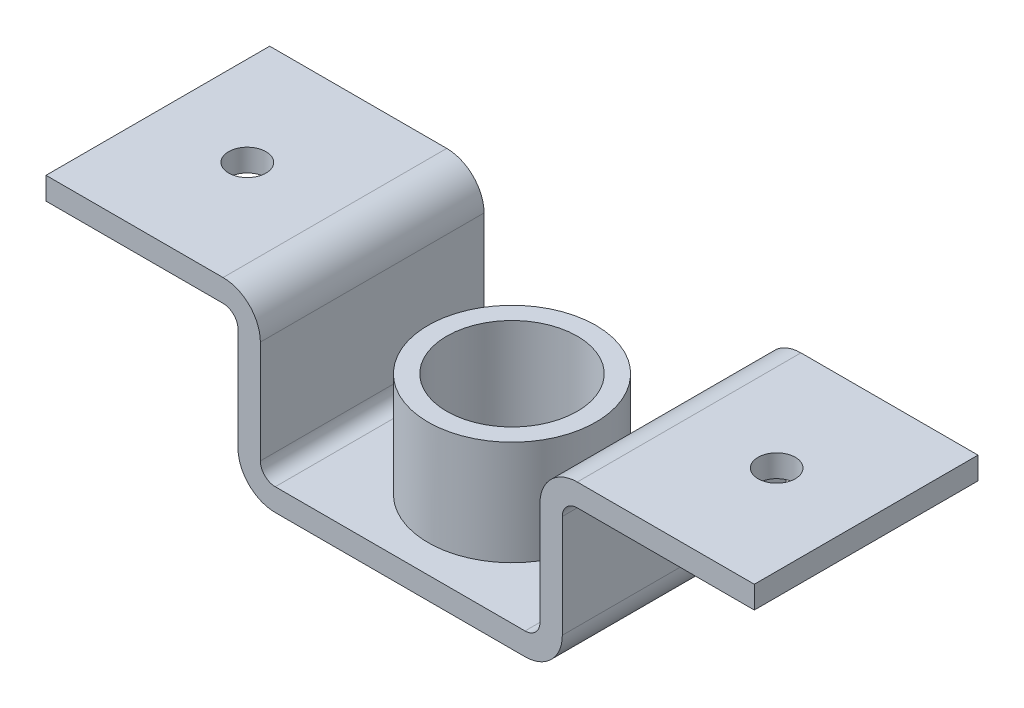
ISO-10303-21;
HEADER;
FILE_DESCRIPTION(('STEP AP214'),'2;1');
FILE_NAME('part.step','',(''),(''),'','','');
FILE_SCHEMA(('AUTOMOTIVE_DESIGN { 1 0 10303 214 1 1 1 1 }'));
ENDSEC;
DATA;
#1=APPLICATION_CONTEXT('core data for automotive mechanical design processes');
#2=APPLICATION_PROTOCOL_DEFINITION('international standard','automotive_design',2000,#1);
#3=PRODUCT_CONTEXT('',#1,'mechanical');
#4=PRODUCT('Part','Part','',(#3));
#5=PRODUCT_RELATED_PRODUCT_CATEGORY('part','',(#4));
#6=PRODUCT_DEFINITION_FORMATION('','',#4);
#7=PRODUCT_DEFINITION_CONTEXT('part definition',#1,'design');
#8=PRODUCT_DEFINITION('design','',#6,#7);
#9=PRODUCT_DEFINITION_SHAPE('','',#8);
#10=(LENGTH_UNIT() NAMED_UNIT(*) SI_UNIT(.MILLI.,.METRE.));
#11=(NAMED_UNIT(*) PLANE_ANGLE_UNIT() SI_UNIT($,.RADIAN.));
#12=(NAMED_UNIT(*) SI_UNIT($,.STERADIAN.) SOLID_ANGLE_UNIT());
#13=UNCERTAINTY_MEASURE_WITH_UNIT(LENGTH_MEASURE(1.E-05),#10,'distance_accuracy_value','');
#14=(GEOMETRIC_REPRESENTATION_CONTEXT(3) GLOBAL_UNCERTAINTY_ASSIGNED_CONTEXT((#13)) GLOBAL_UNIT_ASSIGNED_CONTEXT((#10,
#11,#12)) REPRESENTATION_CONTEXT('',''));
#15=CARTESIAN_POINT('',(0.,0.,0.));
#16=DIRECTION('',(0.,0.,1.));
#17=DIRECTION('',(1.,0.,0.));
#18=AXIS2_PLACEMENT_3D('',#15,#16,#17);
#19=CARTESIAN_POINT('',(-475.,208.,300.));
#20=DIRECTION('',(1.,0.,0.));
#21=DIRECTION('',(0.,0.,-1.));
#22=AXIS2_PLACEMENT_3D('',#19,#20,#21);
#23=PLANE('',#22);
#24=DIRECTION('',(0.,-1.,0.));
#25=VECTOR('',#24,1.);
#26=CARTESIAN_POINT('',(-475.,208.,0.));
#27=LINE('',#26,#25);
#28=CARTESIAN_POINT('',(-475.,238.,0.));
#29=VERTEX_POINT('',#28);
#30=CARTESIAN_POINT('',(-475.,208.,0.));
#31=VERTEX_POINT('',#30);
#32=EDGE_CURVE('E209',#29,#31,#27,.T.);
#33=ORIENTED_EDGE('',*,*,#32,.T.);
#34=DIRECTION('',(0.,0.,-1.));
#35=VECTOR('',#34,1.);
#36=CARTESIAN_POINT('',(-475.,208.,300.));
#37=LINE('',#36,#35);
#38=CARTESIAN_POINT('',(-475.,208.,300.));
#39=VERTEX_POINT('',#38);
#40=EDGE_CURVE('E48',#39,#31,#37,.T.);
#41=ORIENTED_EDGE('',*,*,#40,.F.);
#42=DIRECTION('',(0.,-1.,0.));
#43=VECTOR('',#42,1.);
#44=CARTESIAN_POINT('',(-475.,208.,300.));
#45=LINE('',#44,#43);
#46=CARTESIAN_POINT('',(-475.,238.,300.));
#47=VERTEX_POINT('',#46);
#48=EDGE_CURVE('E247',#47,#39,#45,.T.);
#49=ORIENTED_EDGE('',*,*,#48,.F.);
#50=DIRECTION('',(0.,0.,-1.));
#51=VECTOR('',#50,1.);
#52=CARTESIAN_POINT('',(-475.,238.,300.));
#53=LINE('',#52,#51);
#54=EDGE_CURVE('E205',#47,#29,#53,.T.);
#55=ORIENTED_EDGE('',*,*,#54,.T.);
#56=EDGE_LOOP('',(#33,#41,#49,#55));
#57=FACE_BOUND('',#56,.T.);
#58=ADVANCED_FACE('F39',(#57),#23,.F.);
#59=CARTESIAN_POINT('',(-237.5,208.,300.));
#60=DIRECTION('',(0.,1.,0.));
#61=DIRECTION('',(-1.,0.,0.));
#62=AXIS2_PLACEMENT_3D('',#59,#60,#61);
#63=PLANE('',#62);
#64=CARTESIAN_POINT('',(-355.,208.,150.));
#65=DIRECTION('',(0.,1.,0.));
#66=DIRECTION('',(-1.,0.,0.));
#67=AXIS2_PLACEMENT_3D('',#64,#65,#66);
#68=CIRCLE('',#67,25.);
#69=CARTESIAN_POINT('',(-380.,208.,150.));
#70=VERTEX_POINT('',#69);
#71=EDGE_CURVE('E425',#70,#70,#68,.F.);
#72=ORIENTED_EDGE('',*,*,#71,.F.);
#73=EDGE_LOOP('',(#72));
#74=FACE_BOUND('',#73,.T.);
#75=DIRECTION('',(1.,0.,0.));
#76=VECTOR('',#75,1.);
#77=CARTESIAN_POINT('',(-237.5,208.,0.));
#78=LINE('',#77,#76);
#79=CARTESIAN_POINT('',(-237.5,208.,0.));
#80=VERTEX_POINT('',#79);
#81=EDGE_CURVE('E212',#31,#80,#78,.T.);
#82=ORIENTED_EDGE('',*,*,#81,.T.);
#83=DIRECTION('',(0.,0.,-1.));
#84=VECTOR('',#83,1.);
#85=CARTESIAN_POINT('',(-237.5,208.,300.));
#86=LINE('',#85,#84);
#87=CARTESIAN_POINT('',(-237.5,208.,300.));
#88=VERTEX_POINT('',#87);
#89=EDGE_CURVE('E293',#88,#80,#86,.T.);
#90=ORIENTED_EDGE('',*,*,#89,.F.);
#91=DIRECTION('',(1.,0.,0.));
#92=VECTOR('',#91,1.);
#93=CARTESIAN_POINT('',(-237.5,208.,300.));
#94=LINE('',#93,#92);
#95=EDGE_CURVE('E136',#39,#88,#94,.T.);
#96=ORIENTED_EDGE('',*,*,#95,.F.);
#97=ORIENTED_EDGE('',*,*,#40,.T.);
#98=EDGE_LOOP('',(#82,#90,#96,#97));
#99=FACE_BOUND('',#98,.T.);
#100=ADVANCED_FACE('F297',(#74,#99),#63,.F.);
#101=CARTESIAN_POINT('',(-237.5,188.,300.));
#102=DIRECTION('',(0.,0.,-1.));
#103=DIRECTION('',(-1.,0.,0.));
#104=AXIS2_PLACEMENT_3D('',#101,#102,#103);
#105=CYLINDRICAL_SURFACE('',#104,20.);
#106=CARTESIAN_POINT('',(-237.5,188.,0.));
#107=DIRECTION('',(0.,0.,-1.));
#108=DIRECTION('',(1.,0.,0.));
#109=AXIS2_PLACEMENT_3D('',#106,#107,#108);
#110=CIRCLE('',#109,20.);
#111=CARTESIAN_POINT('',(-217.5,188.,0.));
#112=VERTEX_POINT('',#111);
#113=EDGE_CURVE('E214',#80,#112,#110,.T.);
#114=ORIENTED_EDGE('',*,*,#113,.T.);
#115=DIRECTION('',(0.,0.,-1.));
#116=VECTOR('',#115,1.);
#117=CARTESIAN_POINT('',(-217.5,188.,300.));
#118=LINE('',#117,#116);
#119=CARTESIAN_POINT('',(-217.5,188.,300.));
#120=VERTEX_POINT('',#119);
#121=EDGE_CURVE('E290',#120,#112,#118,.T.);
#122=ORIENTED_EDGE('',*,*,#121,.F.);
#123=CARTESIAN_POINT('',(-237.5,188.,300.));
#124=DIRECTION('',(0.,0.,-1.));
#125=DIRECTION('',(1.,0.,0.));
#126=AXIS2_PLACEMENT_3D('',#123,#124,#125);
#127=CIRCLE('',#126,20.);
#128=EDGE_CURVE('E317',#88,#120,#127,.T.);
#129=ORIENTED_EDGE('',*,*,#128,.F.);
#130=ORIENTED_EDGE('',*,*,#89,.T.);
#131=EDGE_LOOP('',(#114,#122,#129,#130));
#132=FACE_BOUND('',#131,.T.);
#133=ADVANCED_FACE('F308',(#132),#105,.F.);
#134=CARTESIAN_POINT('',(-217.5,50.,300.));
#135=DIRECTION('',(1.,0.,0.));
#136=DIRECTION('',(0.,0.,-1.));
#137=AXIS2_PLACEMENT_3D('',#134,#135,#136);
#138=PLANE('',#137);
#139=DIRECTION('',(0.,-1.,0.));
#140=VECTOR('',#139,1.);
#141=CARTESIAN_POINT('',(-217.5,50.,0.));
#142=LINE('',#141,#140);
#143=CARTESIAN_POINT('',(-217.5,50.,0.));
#144=VERTEX_POINT('',#143);
#145=EDGE_CURVE('E216',#112,#144,#142,.T.);
#146=ORIENTED_EDGE('',*,*,#145,.T.);
#147=DIRECTION('',(0.,0.,-1.));
#148=VECTOR('',#147,1.);
#149=CARTESIAN_POINT('',(-217.5,50.,300.));
#150=LINE('',#149,#148);
#151=CARTESIAN_POINT('',(-217.5,50.,300.));
#152=VERTEX_POINT('',#151);
#153=EDGE_CURVE('E287',#152,#144,#150,.T.);
#154=ORIENTED_EDGE('',*,*,#153,.F.);
#155=DIRECTION('',(0.,-1.,0.));
#156=VECTOR('',#155,1.);
#157=CARTESIAN_POINT('',(-217.5,50.,300.));
#158=LINE('',#157,#156);
#159=EDGE_CURVE('E314',#120,#152,#158,.T.);
#160=ORIENTED_EDGE('',*,*,#159,.F.);
#161=ORIENTED_EDGE('',*,*,#121,.T.);
#162=EDGE_LOOP('',(#146,#154,#160,#161));
#163=FACE_BOUND('',#162,.T.);
#164=ADVANCED_FACE('F312',(#163),#138,.F.);
#165=CARTESIAN_POINT('',(-167.5,50.,300.));
#166=DIRECTION('',(0.,0.,-1.));
#167=DIRECTION('',(-1.,0.,0.));
#168=AXIS2_PLACEMENT_3D('',#165,#166,#167);
#169=CYLINDRICAL_SURFACE('',#168,50.);
#170=CARTESIAN_POINT('',(-167.5,50.,0.));
#171=DIRECTION('',(0.,0.,1.));
#172=DIRECTION('',(-1.,0.,0.));
#173=AXIS2_PLACEMENT_3D('',#170,#171,#172);
#174=CIRCLE('',#173,50.);
#175=CARTESIAN_POINT('',(-167.5,0.,0.));
#176=VERTEX_POINT('',#175);
#177=EDGE_CURVE('E218',#144,#176,#174,.T.);
#178=ORIENTED_EDGE('',*,*,#177,.T.);
#179=DIRECTION('',(0.,0.,-1.));
#180=VECTOR('',#179,1.);
#181=CARTESIAN_POINT('',(-167.5,0.,300.));
#182=LINE('',#181,#180);
#183=CARTESIAN_POINT('',(-167.5,0.,300.));
#184=VERTEX_POINT('',#183);
#185=EDGE_CURVE('E284',#184,#176,#182,.T.);
#186=ORIENTED_EDGE('',*,*,#185,.F.);
#187=CARTESIAN_POINT('',(-167.5,50.,300.));
#188=DIRECTION('',(0.,0.,1.));
#189=DIRECTION('',(-1.,0.,0.));
#190=AXIS2_PLACEMENT_3D('',#187,#188,#189);
#191=CIRCLE('',#190,50.);
#192=EDGE_CURVE('E316',#152,#184,#191,.T.);
#193=ORIENTED_EDGE('',*,*,#192,.F.);
#194=ORIENTED_EDGE('',*,*,#153,.T.);
#195=EDGE_LOOP('',(#178,#186,#193,#194));
#196=FACE_BOUND('',#195,.T.);
#197=ADVANCED_FACE('F404',(#196),#169,.T.);
#198=CARTESIAN_POINT('',(167.5,0.,300.));
#199=DIRECTION('',(0.,1.,0.));
#200=DIRECTION('',(0.,0.,1.));
#201=AXIS2_PLACEMENT_3D('',#198,#199,#200);
#202=PLANE('',#201);
#203=CARTESIAN_POINT('',(0.,0.,150.));
#204=DIRECTION('',(0.,1.,0.));
#205=DIRECTION('',(0.,0.,1.));
#206=AXIS2_PLACEMENT_3D('',#203,#204,#205);
#207=CIRCLE('',#206,37.5);
#208=CARTESIAN_POINT('',(0.,0.,187.5));
#209=VERTEX_POINT('',#208);
#210=EDGE_CURVE('E645',#209,#209,#207,.T.);
#211=ORIENTED_EDGE('',*,*,#210,.T.);
#212=EDGE_LOOP('',(#211));
#213=FACE_BOUND('',#212,.T.);
#214=DIRECTION('',(1.,0.,0.));
#215=VECTOR('',#214,1.);
#216=CARTESIAN_POINT('',(167.5,0.,0.));
#217=LINE('',#216,#215);
#218=CARTESIAN_POINT('',(167.5,0.,0.));
#219=VERTEX_POINT('',#218);
#220=EDGE_CURVE('E220',#176,#219,#217,.T.);
#221=ORIENTED_EDGE('',*,*,#220,.T.);
#222=DIRECTION('',(0.,0.,-1.));
#223=VECTOR('',#222,1.);
#224=CARTESIAN_POINT('',(167.5,0.,300.));
#225=LINE('',#224,#223);
#226=CARTESIAN_POINT('',(167.5,0.,300.));
#227=VERTEX_POINT('',#226);
#228=EDGE_CURVE('E281',#227,#219,#225,.T.);
#229=ORIENTED_EDGE('',*,*,#228,.F.);
#230=DIRECTION('',(1.,0.,0.));
#231=VECTOR('',#230,1.);
#232=CARTESIAN_POINT('',(167.5,0.,300.));
#233=LINE('',#232,#231);
#234=EDGE_CURVE('E319',#184,#227,#233,.T.);
#235=ORIENTED_EDGE('',*,*,#234,.F.);
#236=ORIENTED_EDGE('',*,*,#185,.T.);
#237=EDGE_LOOP('',(#221,#229,#235,#236));
#238=FACE_BOUND('',#237,.T.);
#239=ADVANCED_FACE('F400',(#213,#238),#202,.F.);
#240=CARTESIAN_POINT('',(167.5,50.,300.));
#241=DIRECTION('',(0.,0.,-1.));
#242=DIRECTION('',(-1.,0.,0.));
#243=AXIS2_PLACEMENT_3D('',#240,#241,#242);
#244=CYLINDRICAL_SURFACE('',#243,50.);
#245=CARTESIAN_POINT('',(167.5,50.,0.));
#246=DIRECTION('',(0.,0.,1.));
#247=DIRECTION('',(1.,0.,0.));
#248=AXIS2_PLACEMENT_3D('',#245,#246,#247);
#249=CIRCLE('',#248,50.);
#250=CARTESIAN_POINT('',(217.5,50.,0.));
#251=VERTEX_POINT('',#250);
#252=EDGE_CURVE('E222',#219,#251,#249,.T.);
#253=ORIENTED_EDGE('',*,*,#252,.T.);
#254=DIRECTION('',(0.,0.,-1.));
#255=VECTOR('',#254,1.);
#256=CARTESIAN_POINT('',(217.5,50.,300.));
#257=LINE('',#256,#255);
#258=CARTESIAN_POINT('',(217.5,50.,300.));
#259=VERTEX_POINT('',#258);
#260=EDGE_CURVE('E278',#259,#251,#257,.T.);
#261=ORIENTED_EDGE('',*,*,#260,.F.);
#262=CARTESIAN_POINT('',(167.5,50.,300.));
#263=DIRECTION('',(0.,0.,1.));
#264=DIRECTION('',(1.,0.,0.));
#265=AXIS2_PLACEMENT_3D('',#262,#263,#264);
#266=CIRCLE('',#265,50.);
#267=EDGE_CURVE('E325',#227,#259,#266,.T.);
#268=ORIENTED_EDGE('',*,*,#267,.F.);
#269=ORIENTED_EDGE('',*,*,#228,.T.);
#270=EDGE_LOOP('',(#253,#261,#268,#269));
#271=FACE_BOUND('',#270,.T.);
#272=ADVANCED_FACE('F396',(#271),#244,.T.);
#273=CARTESIAN_POINT('',(217.5,50.,300.));
#274=DIRECTION('',(-1.,0.,0.));
#275=DIRECTION('',(0.,0.,1.));
#276=AXIS2_PLACEMENT_3D('',#273,#274,#275);
#277=PLANE('',#276);
#278=DIRECTION('',(0.,1.,0.));
#279=VECTOR('',#278,1.);
#280=CARTESIAN_POINT('',(217.5,50.,0.));
#281=LINE('',#280,#279);
#282=CARTESIAN_POINT('',(217.5,188.,0.));
#283=VERTEX_POINT('',#282);
#284=EDGE_CURVE('E224',#251,#283,#281,.T.);
#285=ORIENTED_EDGE('',*,*,#284,.T.);
#286=DIRECTION('',(0.,0.,-1.));
#287=VECTOR('',#286,1.);
#288=CARTESIAN_POINT('',(217.5,188.,300.));
#289=LINE('',#288,#287);
#290=CARTESIAN_POINT('',(217.5,188.,300.));
#291=VERTEX_POINT('',#290);
#292=EDGE_CURVE('E275',#291,#283,#289,.T.);
#293=ORIENTED_EDGE('',*,*,#292,.F.);
#294=DIRECTION('',(0.,1.,0.));
#295=VECTOR('',#294,1.);
#296=CARTESIAN_POINT('',(217.5,50.,300.));
#297=LINE('',#296,#295);
#298=EDGE_CURVE('E327',#259,#291,#297,.T.);
#299=ORIENTED_EDGE('',*,*,#298,.F.);
#300=ORIENTED_EDGE('',*,*,#260,.T.);
#301=EDGE_LOOP('',(#285,#293,#299,#300));
#302=FACE_BOUND('',#301,.T.);
#303=ADVANCED_FACE('F392',(#302),#277,.F.);
#304=CARTESIAN_POINT('',(237.5,188.,300.));
#305=DIRECTION('',(0.,0.,-1.));
#306=DIRECTION('',(-1.,0.,0.));
#307=AXIS2_PLACEMENT_3D('',#304,#305,#306);
#308=CYLINDRICAL_SURFACE('',#307,20.);
#309=CARTESIAN_POINT('',(237.5,188.,0.));
#310=DIRECTION('',(0.,0.,-1.));
#311=DIRECTION('',(-1.,0.,0.));
#312=AXIS2_PLACEMENT_3D('',#309,#310,#311);
#313=CIRCLE('',#312,20.);
#314=CARTESIAN_POINT('',(237.5,208.,0.));
#315=VERTEX_POINT('',#314);
#316=EDGE_CURVE('E226',#283,#315,#313,.T.);
#317=ORIENTED_EDGE('',*,*,#316,.T.);
#318=DIRECTION('',(0.,0.,-1.));
#319=VECTOR('',#318,1.);
#320=CARTESIAN_POINT('',(237.5,208.,300.));
#321=LINE('',#320,#319);
#322=CARTESIAN_POINT('',(237.5,208.,300.));
#323=VERTEX_POINT('',#322);
#324=EDGE_CURVE('E272',#323,#315,#321,.T.);
#325=ORIENTED_EDGE('',*,*,#324,.F.);
#326=CARTESIAN_POINT('',(237.5,188.,300.));
#327=DIRECTION('',(0.,0.,-1.));
#328=DIRECTION('',(-1.,0.,0.));
#329=AXIS2_PLACEMENT_3D('',#326,#327,#328);
#330=CIRCLE('',#329,20.);
#331=EDGE_CURVE('E329',#291,#323,#330,.T.);
#332=ORIENTED_EDGE('',*,*,#331,.F.);
#333=ORIENTED_EDGE('',*,*,#292,.T.);
#334=EDGE_LOOP('',(#317,#325,#332,#333));
#335=FACE_BOUND('',#334,.T.);
#336=ADVANCED_FACE('F387',(#335),#308,.F.);
#337=CARTESIAN_POINT('',(237.5,208.,300.));
#338=DIRECTION('',(0.,1.,0.));
#339=DIRECTION('',(-1.,0.,0.));
#340=AXIS2_PLACEMENT_3D('',#337,#338,#339);
#341=PLANE('',#340);
#342=CARTESIAN_POINT('',(355.,208.,150.));
#343=DIRECTION('',(0.,1.,0.));
#344=DIRECTION('',(-1.,0.,0.));
#345=AXIS2_PLACEMENT_3D('',#342,#343,#344);
#346=CIRCLE('',#345,25.);
#347=CARTESIAN_POINT('',(330.,208.,150.));
#348=VERTEX_POINT('',#347);
#349=EDGE_CURVE('E434',#348,#348,#346,.F.);
#350=ORIENTED_EDGE('',*,*,#349,.F.);
#351=EDGE_LOOP('',(#350));
#352=FACE_BOUND('',#351,.T.);
#353=DIRECTION('',(1.,0.,0.));
#354=VECTOR('',#353,1.);
#355=CARTESIAN_POINT('',(237.5,208.,0.));
#356=LINE('',#355,#354);
#357=CARTESIAN_POINT('',(475.,208.,0.));
#358=VERTEX_POINT('',#357);
#359=EDGE_CURVE('E228',#315,#358,#356,.T.);
#360=ORIENTED_EDGE('',*,*,#359,.T.);
#361=DIRECTION('',(0.,0.,-1.));
#362=VECTOR('',#361,1.);
#363=CARTESIAN_POINT('',(475.,208.,300.));
#364=LINE('',#363,#362);
#365=CARTESIAN_POINT('',(475.,208.,300.));
#366=VERTEX_POINT('',#365);
#367=EDGE_CURVE('E269',#366,#358,#364,.T.);
#368=ORIENTED_EDGE('',*,*,#367,.F.);
#369=DIRECTION('',(1.,0.,0.));
#370=VECTOR('',#369,1.);
#371=CARTESIAN_POINT('',(237.5,208.,300.));
#372=LINE('',#371,#370);
#373=EDGE_CURVE('E331',#323,#366,#372,.T.);
#374=ORIENTED_EDGE('',*,*,#373,.F.);
#375=ORIENTED_EDGE('',*,*,#324,.T.);
#376=EDGE_LOOP('',(#360,#368,#374,#375));
#377=FACE_BOUND('',#376,.T.);
#378=ADVANCED_FACE('F381',(#352,#377),#341,.F.);
#379=CARTESIAN_POINT('',(475.,208.,300.));
#380=DIRECTION('',(-1.,0.,0.));
#381=DIRECTION('',(0.,0.,1.));
#382=AXIS2_PLACEMENT_3D('',#379,#380,#381);
#383=PLANE('',#382);
#384=DIRECTION('',(0.,1.,0.));
#385=VECTOR('',#384,1.);
#386=CARTESIAN_POINT('',(475.,208.,0.));
#387=LINE('',#386,#385);
#388=CARTESIAN_POINT('',(475.,238.,0.));
#389=VERTEX_POINT('',#388);
#390=EDGE_CURVE('E230',#358,#389,#387,.T.);
#391=ORIENTED_EDGE('',*,*,#390,.T.);
#392=DIRECTION('',(0.,0.,-1.));
#393=VECTOR('',#392,1.);
#394=CARTESIAN_POINT('',(475.,238.,300.));
#395=LINE('',#394,#393);
#396=CARTESIAN_POINT('',(475.,238.,300.));
#397=VERTEX_POINT('',#396);
#398=EDGE_CURVE('E266',#397,#389,#395,.T.);
#399=ORIENTED_EDGE('',*,*,#398,.F.);
#400=DIRECTION('',(0.,1.,0.));
#401=VECTOR('',#400,1.);
#402=CARTESIAN_POINT('',(475.,208.,300.));
#403=LINE('',#402,#401);
#404=EDGE_CURVE('E333',#366,#397,#403,.T.);
#405=ORIENTED_EDGE('',*,*,#404,.F.);
#406=ORIENTED_EDGE('',*,*,#367,.T.);
#407=EDGE_LOOP('',(#391,#399,#405,#406));
#408=FACE_BOUND('',#407,.T.);
#409=ADVANCED_FACE('F377',(#408),#383,.F.);
#410=CARTESIAN_POINT('',(475.,238.,300.));
#411=DIRECTION('',(0.,-1.,0.));
#412=DIRECTION('',(0.,0.,-1.));
#413=AXIS2_PLACEMENT_3D('',#410,#411,#412);
#414=PLANE('',#413);
#415=CARTESIAN_POINT('',(355.,238.,150.));
#416=DIRECTION('',(0.,-1.,0.));
#417=DIRECTION('',(0.,0.,-1.));
#418=AXIS2_PLACEMENT_3D('',#415,#416,#417);
#419=CIRCLE('',#418,25.);
#420=CARTESIAN_POINT('',(355.,238.,125.));
#421=VERTEX_POINT('',#420);
#422=EDGE_CURVE('E647',#421,#421,#419,.T.);
#423=ORIENTED_EDGE('',*,*,#422,.T.);
#424=EDGE_LOOP('',(#423));
#425=FACE_BOUND('',#424,.T.);
#426=DIRECTION('',(-1.,0.,0.));
#427=VECTOR('',#426,1.);
#428=CARTESIAN_POINT('',(475.,238.,0.));
#429=LINE('',#428,#427);
#430=CARTESIAN_POINT('',(237.5,238.,0.));
#431=VERTEX_POINT('',#430);
#432=EDGE_CURVE('E232',#389,#431,#429,.T.);
#433=ORIENTED_EDGE('',*,*,#432,.T.);
#434=DIRECTION('',(0.,0.,-1.));
#435=VECTOR('',#434,1.);
#436=CARTESIAN_POINT('',(237.5,238.,300.));
#437=LINE('',#436,#435);
#438=CARTESIAN_POINT('',(237.5,238.,300.));
#439=VERTEX_POINT('',#438);
#440=EDGE_CURVE('E263',#439,#431,#437,.T.);
#441=ORIENTED_EDGE('',*,*,#440,.F.);
#442=DIRECTION('',(-1.,0.,0.));
#443=VECTOR('',#442,1.);
#444=CARTESIAN_POINT('',(475.,238.,300.));
#445=LINE('',#444,#443);
#446=EDGE_CURVE('E335',#397,#439,#445,.T.);
#447=ORIENTED_EDGE('',*,*,#446,.F.);
#448=ORIENTED_EDGE('',*,*,#398,.T.);
#449=EDGE_LOOP('',(#433,#441,#447,#448));
#450=FACE_BOUND('',#449,.T.);
#451=ADVANCED_FACE('F372',(#425,#450),#414,.F.);
#452=CARTESIAN_POINT('',(237.5,188.,300.));
#453=DIRECTION('',(0.,0.,-1.));
#454=DIRECTION('',(-1.,0.,0.));
#455=AXIS2_PLACEMENT_3D('',#452,#453,#454);
#456=CYLINDRICAL_SURFACE('',#455,50.);
#457=CARTESIAN_POINT('',(237.5,188.,0.));
#458=DIRECTION('',(0.,0.,1.));
#459=DIRECTION('',(-1.,0.,0.));
#460=AXIS2_PLACEMENT_3D('',#457,#458,#459);
#461=CIRCLE('',#460,50.);
#462=CARTESIAN_POINT('',(187.5,188.,0.));
#463=VERTEX_POINT('',#462);
#464=EDGE_CURVE('E234',#431,#463,#461,.T.);
#465=ORIENTED_EDGE('',*,*,#464,.T.);
#466=DIRECTION('',(0.,0.,-1.));
#467=VECTOR('',#466,1.);
#468=CARTESIAN_POINT('',(187.5,188.,300.));
#469=LINE('',#468,#467);
#470=CARTESIAN_POINT('',(187.5,188.,300.));
#471=VERTEX_POINT('',#470);
#472=EDGE_CURVE('E260',#471,#463,#469,.T.);
#473=ORIENTED_EDGE('',*,*,#472,.F.);
#474=CARTESIAN_POINT('',(237.5,188.,300.));
#475=DIRECTION('',(0.,0.,1.));
#476=DIRECTION('',(-1.,0.,0.));
#477=AXIS2_PLACEMENT_3D('',#474,#475,#476);
#478=CIRCLE('',#477,50.);
#479=EDGE_CURVE('E337',#439,#471,#478,.T.);
#480=ORIENTED_EDGE('',*,*,#479,.F.);
#481=ORIENTED_EDGE('',*,*,#440,.T.);
#482=EDGE_LOOP('',(#465,#473,#480,#481));
#483=FACE_BOUND('',#482,.T.);
#484=ADVANCED_FACE('F366',(#483),#456,.T.);
#485=CARTESIAN_POINT('',(187.5,188.,300.));
#486=DIRECTION('',(1.,0.,0.));
#487=DIRECTION('',(0.,0.,-1.));
#488=AXIS2_PLACEMENT_3D('',#485,#486,#487);
#489=PLANE('',#488);
#490=DIRECTION('',(0.,-1.,0.));
#491=VECTOR('',#490,1.);
#492=CARTESIAN_POINT('',(187.5,188.,0.));
#493=LINE('',#492,#491);
#494=CARTESIAN_POINT('',(187.5,50.0000000000001,0.));
#495=VERTEX_POINT('',#494);
#496=EDGE_CURVE('E236',#463,#495,#493,.T.);
#497=ORIENTED_EDGE('',*,*,#496,.T.);
#498=DIRECTION('',(0.,0.,-1.));
#499=VECTOR('',#498,1.);
#500=CARTESIAN_POINT('',(187.5,50.0000000000001,300.));
#501=LINE('',#500,#499);
#502=CARTESIAN_POINT('',(187.5,50.0000000000001,300.));
#503=VERTEX_POINT('',#502);
#504=EDGE_CURVE('E257',#503,#495,#501,.T.);
#505=ORIENTED_EDGE('',*,*,#504,.F.);
#506=DIRECTION('',(0.,-1.,0.));
#507=VECTOR('',#506,1.);
#508=CARTESIAN_POINT('',(187.5,188.,300.));
#509=LINE('',#508,#507);
#510=EDGE_CURVE('E339',#471,#503,#509,.T.);
#511=ORIENTED_EDGE('',*,*,#510,.F.);
#512=ORIENTED_EDGE('',*,*,#472,.T.);
#513=EDGE_LOOP('',(#497,#505,#511,#512));
#514=FACE_BOUND('',#513,.T.);
#515=ADVANCED_FACE('F362',(#514),#489,.F.);
#516=CARTESIAN_POINT('',(167.5,50.,300.));
#517=DIRECTION('',(0.,0.,-1.));
#518=DIRECTION('',(-1.,0.,0.));
#519=AXIS2_PLACEMENT_3D('',#516,#517,#518);
#520=CYLINDRICAL_SURFACE('',#519,20.);
#521=CARTESIAN_POINT('',(167.5,50.,0.));
#522=DIRECTION('',(0.,0.,-1.));
#523=DIRECTION('',(1.,0.,0.));
#524=AXIS2_PLACEMENT_3D('',#521,#522,#523);
#525=CIRCLE('',#524,20.);
#526=CARTESIAN_POINT('',(167.5,30.,0.));
#527=VERTEX_POINT('',#526);
#528=EDGE_CURVE('E238',#495,#527,#525,.T.);
#529=ORIENTED_EDGE('',*,*,#528,.T.);
#530=DIRECTION('',(0.,0.,-1.));
#531=VECTOR('',#530,1.);
#532=CARTESIAN_POINT('',(167.5,30.,300.));
#533=LINE('',#532,#531);
#534=CARTESIAN_POINT('',(167.5,30.,300.));
#535=VERTEX_POINT('',#534);
#536=EDGE_CURVE('E254',#535,#527,#533,.T.);
#537=ORIENTED_EDGE('',*,*,#536,.F.);
#538=CARTESIAN_POINT('',(167.5,50.,300.));
#539=DIRECTION('',(0.,0.,-1.));
#540=DIRECTION('',(1.,0.,0.));
#541=AXIS2_PLACEMENT_3D('',#538,#539,#540);
#542=CIRCLE('',#541,20.);
#543=EDGE_CURVE('E341',#503,#535,#542,.T.);
#544=ORIENTED_EDGE('',*,*,#543,.F.);
#545=ORIENTED_EDGE('',*,*,#504,.T.);
#546=EDGE_LOOP('',(#529,#537,#544,#545));
#547=FACE_BOUND('',#546,.T.);
#548=ADVANCED_FACE('F358',(#547),#520,.F.);
#549=CARTESIAN_POINT('',(-167.5,30.,300.));
#550=DIRECTION('',(0.,-1.,0.));
#551=DIRECTION('',(0.,0.,-1.));
#552=AXIS2_PLACEMENT_3D('',#549,#550,#551);
#553=PLANE('',#552);
#554=CARTESIAN_POINT('',(0.,30.,150.));
#555=DIRECTION('',(0.,-1.,0.));
#556=DIRECTION('',(0.,0.,-1.));
#557=AXIS2_PLACEMENT_3D('',#554,#555,#556);
#558=CIRCLE('',#557,112.5);
#559=CARTESIAN_POINT('',(0.,30.,37.5));
#560=VERTEX_POINT('',#559);
#561=EDGE_CURVE('E11',#560,#560,#558,.F.);
#562=ORIENTED_EDGE('',*,*,#561,.F.);
#563=EDGE_LOOP('',(#562));
#564=FACE_BOUND('',#563,.T.);
#565=DIRECTION('',(-1.,0.,0.));
#566=VECTOR('',#565,1.);
#567=CARTESIAN_POINT('',(-167.5,30.,0.));
#568=LINE('',#567,#566);
#569=CARTESIAN_POINT('',(-167.5,30.,0.));
#570=VERTEX_POINT('',#569);
#571=EDGE_CURVE('E240',#527,#570,#568,.T.);
#572=ORIENTED_EDGE('',*,*,#571,.T.);
#573=DIRECTION('',(0.,0.,-1.));
#574=VECTOR('',#573,1.);
#575=CARTESIAN_POINT('',(-167.5,30.,300.));
#576=LINE('',#575,#574);
#577=CARTESIAN_POINT('',(-167.5,30.,300.));
#578=VERTEX_POINT('',#577);
#579=EDGE_CURVE('E251',#578,#570,#576,.T.);
#580=ORIENTED_EDGE('',*,*,#579,.F.);
#581=DIRECTION('',(-1.,0.,0.));
#582=VECTOR('',#581,1.);
#583=CARTESIAN_POINT('',(-167.5,30.,300.));
#584=LINE('',#583,#582);
#585=EDGE_CURVE('E343',#535,#578,#584,.T.);
#586=ORIENTED_EDGE('',*,*,#585,.F.);
#587=ORIENTED_EDGE('',*,*,#536,.T.);
#588=EDGE_LOOP('',(#572,#580,#586,#587));
#589=FACE_BOUND('',#588,.T.);
#590=ADVANCED_FACE('F349',(#564,#589),#553,.F.);
#591=CARTESIAN_POINT('',(-167.5,50.,300.));
#592=DIRECTION('',(0.,0.,-1.));
#593=DIRECTION('',(-1.,0.,0.));
#594=AXIS2_PLACEMENT_3D('',#591,#592,#593);
#595=CYLINDRICAL_SURFACE('',#594,20.);
#596=CARTESIAN_POINT('',(-167.5,50.,0.));
#597=DIRECTION('',(0.,0.,-1.));
#598=DIRECTION('',(-1.,0.,0.));
#599=AXIS2_PLACEMENT_3D('',#596,#597,#598);
#600=CIRCLE('',#599,20.);
#601=CARTESIAN_POINT('',(-187.5,50.,0.));
#602=VERTEX_POINT('',#601);
#603=EDGE_CURVE('E242',#570,#602,#600,.T.);
#604=ORIENTED_EDGE('',*,*,#603,.T.);
#605=DIRECTION('',(0.,0.,-1.));
#606=VECTOR('',#605,1.);
#607=CARTESIAN_POINT('',(-187.5,50.,300.));
#608=LINE('',#607,#606);
#609=CARTESIAN_POINT('',(-187.5,50.,300.));
#610=VERTEX_POINT('',#609);
#611=EDGE_CURVE('E200',#610,#602,#608,.T.);
#612=ORIENTED_EDGE('',*,*,#611,.F.);
#613=CARTESIAN_POINT('',(-167.5,50.,300.));
#614=DIRECTION('',(0.,0.,-1.));
#615=DIRECTION('',(-1.,0.,0.));
#616=AXIS2_PLACEMENT_3D('',#613,#614,#615);
#617=CIRCLE('',#616,20.);
#618=EDGE_CURVE('E191',#578,#610,#617,.T.);
#619=ORIENTED_EDGE('',*,*,#618,.F.);
#620=ORIENTED_EDGE('',*,*,#579,.T.);
#621=EDGE_LOOP('',(#604,#612,#619,#620));
#622=FACE_BOUND('',#621,.T.);
#623=ADVANCED_FACE('F353',(#622),#595,.F.);
#624=CARTESIAN_POINT('',(-187.5,188.,300.));
#625=DIRECTION('',(-1.,0.,0.));
#626=DIRECTION('',(0.,0.,1.));
#627=AXIS2_PLACEMENT_3D('',#624,#625,#626);
#628=PLANE('',#627);
#629=DIRECTION('',(0.,1.,0.));
#630=VECTOR('',#629,1.);
#631=CARTESIAN_POINT('',(-187.5,188.,0.));
#632=LINE('',#631,#630);
#633=CARTESIAN_POINT('',(-187.5,188.,0.));
#634=VERTEX_POINT('',#633);
#635=EDGE_CURVE('E199',#602,#634,#632,.T.);
#636=ORIENTED_EDGE('',*,*,#635,.T.);
#637=DIRECTION('',(0.,0.,-1.));
#638=VECTOR('',#637,1.);
#639=CARTESIAN_POINT('',(-187.5,188.,300.));
#640=LINE('',#639,#638);
#641=CARTESIAN_POINT('',(-187.5,188.,300.));
#642=VERTEX_POINT('',#641);
#643=EDGE_CURVE('E196',#642,#634,#640,.T.);
#644=ORIENTED_EDGE('',*,*,#643,.F.);
#645=DIRECTION('',(0.,1.,0.));
#646=VECTOR('',#645,1.);
#647=CARTESIAN_POINT('',(-187.5,188.,300.));
#648=LINE('',#647,#646);
#649=EDGE_CURVE('E185',#610,#642,#648,.T.);
#650=ORIENTED_EDGE('',*,*,#649,.F.);
#651=ORIENTED_EDGE('',*,*,#611,.T.);
#652=EDGE_LOOP('',(#636,#644,#650,#651));
#653=FACE_BOUND('',#652,.T.);
#654=ADVANCED_FACE('F197',(#653),#628,.F.);
#655=CARTESIAN_POINT('',(-237.5,188.,300.));
#656=DIRECTION('',(0.,0.,-1.));
#657=DIRECTION('',(-1.,0.,0.));
#658=AXIS2_PLACEMENT_3D('',#655,#656,#657);
#659=CYLINDRICAL_SURFACE('',#658,50.);
#660=CARTESIAN_POINT('',(-237.5,188.,0.));
#661=DIRECTION('',(0.,0.,1.));
#662=DIRECTION('',(1.,0.,0.));
#663=AXIS2_PLACEMENT_3D('',#660,#661,#662);
#664=CIRCLE('',#663,50.);
#665=CARTESIAN_POINT('',(-237.5,238.,0.));
#666=VERTEX_POINT('',#665);
#667=EDGE_CURVE('E121',#634,#666,#664,.T.);
#668=ORIENTED_EDGE('',*,*,#667,.T.);
#669=DIRECTION('',(0.,0.,-1.));
#670=VECTOR('',#669,1.);
#671=CARTESIAN_POINT('',(-237.5,238.,300.));
#672=LINE('',#671,#670);
#673=CARTESIAN_POINT('',(-237.5,238.,300.));
#674=VERTEX_POINT('',#673);
#675=EDGE_CURVE('E201',#674,#666,#672,.T.);
#676=ORIENTED_EDGE('',*,*,#675,.F.);
#677=CARTESIAN_POINT('',(-237.5,188.,300.));
#678=DIRECTION('',(0.,0.,1.));
#679=DIRECTION('',(1.,0.,0.));
#680=AXIS2_PLACEMENT_3D('',#677,#678,#679);
#681=CIRCLE('',#680,50.);
#682=EDGE_CURVE('E189',#642,#674,#681,.T.);
#683=ORIENTED_EDGE('',*,*,#682,.F.);
#684=ORIENTED_EDGE('',*,*,#643,.T.);
#685=EDGE_LOOP('',(#668,#676,#683,#684));
#686=FACE_BOUND('',#685,.T.);
#687=ADVANCED_FACE('F203',(#686),#659,.T.);
#688=CARTESIAN_POINT('',(-475.,238.,300.));
#689=DIRECTION('',(0.,-1.,0.));
#690=DIRECTION('',(0.,0.,-1.));
#691=AXIS2_PLACEMENT_3D('',#688,#689,#690);
#692=PLANE('',#691);
#693=CARTESIAN_POINT('',(-355.,238.,150.));
#694=DIRECTION('',(0.,-1.,0.));
#695=DIRECTION('',(0.,0.,-1.));
#696=AXIS2_PLACEMENT_3D('',#693,#694,#695);
#697=CIRCLE('',#696,25.);
#698=CARTESIAN_POINT('',(-355.,238.,125.));
#699=VERTEX_POINT('',#698);
#700=EDGE_CURVE('E428',#699,#699,#697,.T.);
#701=ORIENTED_EDGE('',*,*,#700,.T.);
#702=EDGE_LOOP('',(#701));
#703=FACE_BOUND('',#702,.T.);
#704=DIRECTION('',(-1.,0.,0.));
#705=VECTOR('',#704,1.);
#706=CARTESIAN_POINT('',(-475.,238.,0.));
#707=LINE('',#706,#705);
#708=EDGE_CURVE('E127',#666,#29,#707,.T.);
#709=ORIENTED_EDGE('',*,*,#708,.T.);
#710=ORIENTED_EDGE('',*,*,#54,.F.);
#711=DIRECTION('',(-1.,0.,0.));
#712=VECTOR('',#711,1.);
#713=CARTESIAN_POINT('',(-475.,238.,300.));
#714=LINE('',#713,#712);
#715=EDGE_CURVE('E56',#674,#47,#714,.T.);
#716=ORIENTED_EDGE('',*,*,#715,.F.);
#717=ORIENTED_EDGE('',*,*,#675,.T.);
#718=EDGE_LOOP('',(#709,#710,#716,#717));
#719=FACE_BOUND('',#718,.T.);
#720=ADVANCED_FACE('F463',(#703,#719),#692,.F.);
#721=CARTESIAN_POINT('',(-237.5,188.,300.));
#722=DIRECTION('',(0.,0.,1.));
#723=DIRECTION('',(1.,0.,0.));
#724=AXIS2_PLACEMENT_3D('',#721,#722,#723);
#725=PLANE('',#724);
#726=ORIENTED_EDGE('',*,*,#48,.T.);
#727=ORIENTED_EDGE('',*,*,#95,.T.);
#728=ORIENTED_EDGE('',*,*,#128,.T.);
#729=ORIENTED_EDGE('',*,*,#159,.T.);
#730=ORIENTED_EDGE('',*,*,#192,.T.);
#731=ORIENTED_EDGE('',*,*,#234,.T.);
#732=ORIENTED_EDGE('',*,*,#267,.T.);
#733=ORIENTED_EDGE('',*,*,#298,.T.);
#734=ORIENTED_EDGE('',*,*,#331,.T.);
#735=ORIENTED_EDGE('',*,*,#373,.T.);
#736=ORIENTED_EDGE('',*,*,#404,.T.);
#737=ORIENTED_EDGE('',*,*,#446,.T.);
#738=ORIENTED_EDGE('',*,*,#479,.T.);
#739=ORIENTED_EDGE('',*,*,#510,.T.);
#740=ORIENTED_EDGE('',*,*,#543,.T.);
#741=ORIENTED_EDGE('',*,*,#585,.T.);
#742=ORIENTED_EDGE('',*,*,#618,.T.);
#743=ORIENTED_EDGE('',*,*,#649,.T.);
#744=ORIENTED_EDGE('',*,*,#682,.T.);
#745=ORIENTED_EDGE('',*,*,#715,.T.);
#746=EDGE_LOOP('',(#726,#727,#728,#729,#730,#731,#732,#733,#734,#735,#736,#737,#738,#739,#740,
#741,#742,#743,#744,#745));
#747=FACE_BOUND('',#746,.T.);
#748=ADVANCED_FACE('F187',(#747),#725,.T.);
#749=CARTESIAN_POINT('',(-237.5,188.,0.));
#750=DIRECTION('',(0.,0.,1.));
#751=DIRECTION('',(1.,0.,0.));
#752=AXIS2_PLACEMENT_3D('',#749,#750,#751);
#753=PLANE('',#752);
#754=ORIENTED_EDGE('',*,*,#32,.F.);
#755=ORIENTED_EDGE('',*,*,#708,.F.);
#756=ORIENTED_EDGE('',*,*,#667,.F.);
#757=ORIENTED_EDGE('',*,*,#635,.F.);
#758=ORIENTED_EDGE('',*,*,#603,.F.);
#759=ORIENTED_EDGE('',*,*,#571,.F.);
#760=ORIENTED_EDGE('',*,*,#528,.F.);
#761=ORIENTED_EDGE('',*,*,#496,.F.);
#762=ORIENTED_EDGE('',*,*,#464,.F.);
#763=ORIENTED_EDGE('',*,*,#432,.F.);
#764=ORIENTED_EDGE('',*,*,#390,.F.);
#765=ORIENTED_EDGE('',*,*,#359,.F.);
#766=ORIENTED_EDGE('',*,*,#316,.F.);
#767=ORIENTED_EDGE('',*,*,#284,.F.);
#768=ORIENTED_EDGE('',*,*,#252,.F.);
#769=ORIENTED_EDGE('',*,*,#220,.F.);
#770=ORIENTED_EDGE('',*,*,#177,.F.);
#771=ORIENTED_EDGE('',*,*,#145,.F.);
#772=ORIENTED_EDGE('',*,*,#113,.F.);
#773=ORIENTED_EDGE('',*,*,#81,.F.);
#774=EDGE_LOOP('',(#754,#755,#756,#757,#758,#759,#760,#761,#762,#763,#764,#765,#766,#767,#768,
#769,#770,#771,#772,#773));
#775=FACE_BOUND('',#774,.T.);
#776=ADVANCED_FACE('F302',(#775),#753,.F.);
#777=CARTESIAN_POINT('',(0.,170.,150.));
#778=DIRECTION('',(0.,-1.,0.));
#779=DIRECTION('',(0.,0.,-1.));
#780=AXIS2_PLACEMENT_3D('',#777,#778,#779);
#781=CYLINDRICAL_SURFACE('',#780,87.5);
#782=CARTESIAN_POINT('',(0.,170.,150.));
#783=DIRECTION('',(0.,1.,0.));
#784=DIRECTION('',(0.,0.,1.));
#785=AXIS2_PLACEMENT_3D('',#782,#783,#784);
#786=CIRCLE('',#785,87.5);
#787=CARTESIAN_POINT('',(0.,170.,237.5));
#788=VERTEX_POINT('',#787);
#789=EDGE_CURVE('E427',#788,#788,#786,.T.);
#790=ORIENTED_EDGE('',*,*,#789,.T.);
#791=EDGE_LOOP('',(#790));
#792=FACE_BOUND('',#791,.T.);
#793=CARTESIAN_POINT('',(0.,30.,150.));
#794=DIRECTION('',(0.,-1.,0.));
#795=DIRECTION('',(0.,0.,-1.));
#796=AXIS2_PLACEMENT_3D('',#793,#794,#795);
#797=CIRCLE('',#796,87.5);
#798=CARTESIAN_POINT('',(0.,30.,62.5));
#799=VERTEX_POINT('',#798);
#800=EDGE_CURVE('E42',#799,#799,#797,.F.);
#801=ORIENTED_EDGE('',*,*,#800,.F.);
#802=EDGE_LOOP('',(#801));
#803=FACE_BOUND('',#802,.T.);
#804=ADVANCED_FACE('F447',(#792,#803),#781,.F.);
#805=CARTESIAN_POINT('',(0.,170.,150.));
#806=DIRECTION('',(0.,-1.,0.));
#807=DIRECTION('',(0.,0.,-1.));
#808=AXIS2_PLACEMENT_3D('',#805,#806,#807);
#809=CYLINDRICAL_SURFACE('',#808,112.5);
#810=CARTESIAN_POINT('',(0.,170.,150.));
#811=DIRECTION('',(0.,1.,0.));
#812=DIRECTION('',(0.,0.,1.));
#813=AXIS2_PLACEMENT_3D('',#810,#811,#812);
#814=CIRCLE('',#813,112.5);
#815=CARTESIAN_POINT('',(0.,170.,262.5));
#816=VERTEX_POINT('',#815);
#817=EDGE_CURVE('E431',#816,#816,#814,.T.);
#818=ORIENTED_EDGE('',*,*,#817,.F.);
#819=EDGE_LOOP('',(#818));
#820=FACE_BOUND('',#819,.T.);
#821=ORIENTED_EDGE('',*,*,#561,.T.);
#822=EDGE_LOOP('',(#821));
#823=FACE_BOUND('',#822,.T.);
#824=ADVANCED_FACE('F449',(#820,#823),#809,.T.);
#825=CARTESIAN_POINT('',(0.,170.,0.));
#826=DIRECTION('',(0.,1.,0.));
#827=DIRECTION('',(0.,0.,1.));
#828=AXIS2_PLACEMENT_3D('',#825,#826,#827);
#829=PLANE('',#828);
#830=ORIENTED_EDGE('',*,*,#789,.F.);
#831=EDGE_LOOP('',(#830));
#832=FACE_BOUND('',#831,.T.);
#833=ORIENTED_EDGE('',*,*,#817,.T.);
#834=EDGE_LOOP('',(#833));
#835=FACE_BOUND('',#834,.T.);
#836=ADVANCED_FACE('F456',(#832,#835),#829,.T.);
#837=CARTESIAN_POINT('',(0.,30.,150.));
#838=DIRECTION('',(0.,-1.,0.));
#839=DIRECTION('',(0.,0.,-1.));
#840=AXIS2_PLACEMENT_3D('',#837,#838,#839);
#841=CIRCLE('',#840,37.5);
#842=CARTESIAN_POINT('',(0.,30.,112.5));
#843=VERTEX_POINT('',#842);
#844=EDGE_CURVE('E642',#843,#843,#841,.T.);
#845=ORIENTED_EDGE('',*,*,#844,.T.);
#846=EDGE_LOOP('',(#845));
#847=FACE_BOUND('',#846,.T.);
#848=ORIENTED_EDGE('',*,*,#800,.T.);
#849=EDGE_LOOP('',(#848));
#850=FACE_BOUND('',#849,.T.);
#851=ADVANCED_FACE('F445',(#847,#850),#553,.F.);
#852=CARTESIAN_POINT('',(-355.,308.710678118655,150.));
#853=DIRECTION('',(0.,-1.,0.));
#854=DIRECTION('',(0.,0.,-1.));
#855=AXIS2_PLACEMENT_3D('',#852,#853,#854);
#856=CYLINDRICAL_SURFACE('',#855,25.);
#857=ORIENTED_EDGE('',*,*,#700,.F.);
#858=EDGE_LOOP('',(#857));
#859=FACE_BOUND('',#858,.T.);
#860=ORIENTED_EDGE('',*,*,#71,.T.);
#861=EDGE_LOOP('',(#860));
#862=FACE_BOUND('',#861,.T.);
#863=ADVANCED_FACE('F578',(#859,#862),#856,.F.);
#864=CARTESIAN_POINT('',(355.,308.710678118655,150.));
#865=DIRECTION('',(0.,-1.,0.));
#866=DIRECTION('',(0.,0.,-1.));
#867=AXIS2_PLACEMENT_3D('',#864,#865,#866);
#868=CYLINDRICAL_SURFACE('',#867,25.);
#869=ORIENTED_EDGE('',*,*,#422,.F.);
#870=EDGE_LOOP('',(#869));
#871=FACE_BOUND('',#870,.T.);
#872=ORIENTED_EDGE('',*,*,#349,.T.);
#873=EDGE_LOOP('',(#872));
#874=FACE_BOUND('',#873,.T.);
#875=ADVANCED_FACE('F610',(#871,#874),#868,.F.);
#876=CARTESIAN_POINT('',(0.,136.066017177982,150.));
#877=DIRECTION('',(0.,-1.,0.));
#878=DIRECTION('',(0.,0.,-1.));
#879=AXIS2_PLACEMENT_3D('',#876,#877,#878);
#880=CYLINDRICAL_SURFACE('',#879,37.5);
#881=ORIENTED_EDGE('',*,*,#844,.F.);
#882=EDGE_LOOP('',(#881));
#883=FACE_BOUND('',#882,.T.);
#884=ORIENTED_EDGE('',*,*,#210,.F.);
#885=EDGE_LOOP('',(#884));
#886=FACE_BOUND('',#885,.T.);
#887=ADVANCED_FACE('F620',(#883,#886),#880,.F.);
#888=CLOSED_SHELL('',(#58,#100,#133,#164,#197,#239,#272,#303,#336,#378,#409,#451,#484,#515,#548,
#590,#623,#654,#687,#720,#748,#776,#804,#824,#836,#851,#863,#875,#887));
#889=MANIFOLD_SOLID_BREP('B2',#888);
#890=ADVANCED_BREP_SHAPE_REPRESENTATION('',(#18,#889),#14);
#891=SHAPE_DEFINITION_REPRESENTATION(#9,#890);
ENDSEC;
END-ISO-10303-21;
